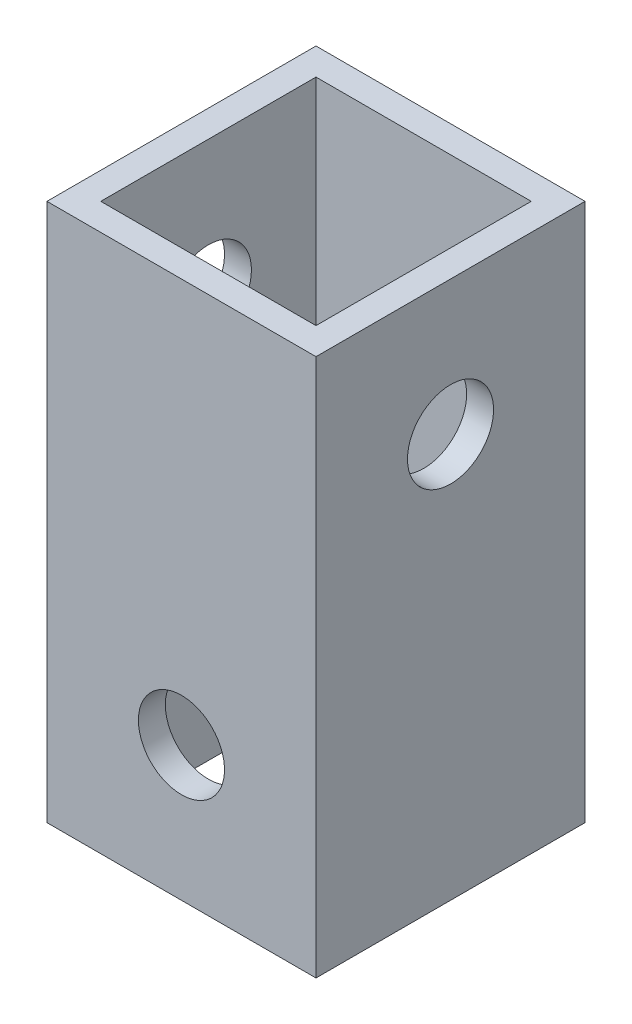
ISO-10303-21;
HEADER;
FILE_DESCRIPTION(('STEP AP214'),'2;1');
FILE_NAME('part.step','',(''),(''),'','','');
FILE_SCHEMA(('AUTOMOTIVE_DESIGN { 1 0 10303 214 1 1 1 1 }'));
ENDSEC;
DATA;
#1=APPLICATION_CONTEXT('core data for automotive mechanical design processes');
#2=APPLICATION_PROTOCOL_DEFINITION('international standard','automotive_design',2000,#1);
#3=PRODUCT_CONTEXT('',#1,'mechanical');
#4=PRODUCT('Part','Part','',(#3));
#5=PRODUCT_RELATED_PRODUCT_CATEGORY('part','',(#4));
#6=PRODUCT_DEFINITION_FORMATION('','',#4);
#7=PRODUCT_DEFINITION_CONTEXT('part definition',#1,'design');
#8=PRODUCT_DEFINITION('design','',#6,#7);
#9=PRODUCT_DEFINITION_SHAPE('','',#8);
#10=(LENGTH_UNIT() NAMED_UNIT(*) SI_UNIT(.MILLI.,.METRE.));
#11=(NAMED_UNIT(*) PLANE_ANGLE_UNIT() SI_UNIT($,.RADIAN.));
#12=(NAMED_UNIT(*) SI_UNIT($,.STERADIAN.) SOLID_ANGLE_UNIT());
#13=UNCERTAINTY_MEASURE_WITH_UNIT(LENGTH_MEASURE(1.E-05),#10,'distance_accuracy_value','');
#14=(GEOMETRIC_REPRESENTATION_CONTEXT(3) GLOBAL_UNCERTAINTY_ASSIGNED_CONTEXT((#13)) GLOBAL_UNIT_ASSIGNED_CONTEXT((#10,
#11,#12)) REPRESENTATION_CONTEXT('',''));
#15=CARTESIAN_POINT('',(0.,0.,0.));
#16=DIRECTION('',(0.,0.,1.));
#17=DIRECTION('',(1.,0.,0.));
#18=AXIS2_PLACEMENT_3D('',#15,#16,#17);
#19=CARTESIAN_POINT('',(0.,20.,0.));
#20=DIRECTION('',(0.,1.,0.));
#21=DIRECTION('',(0.,0.,1.));
#22=AXIS2_PLACEMENT_3D('',#19,#20,#21);
#23=PLANE('',#22);
#24=DIRECTION('',(0.,0.,-1.));
#25=VECTOR('',#24,1.);
#26=CARTESIAN_POINT('',(5.,20.,-5.));
#27=LINE('',#26,#25);
#28=CARTESIAN_POINT('',(5.,20.,5.));
#29=VERTEX_POINT('',#28);
#30=CARTESIAN_POINT('',(5.,20.,-5.));
#31=VERTEX_POINT('',#30);
#32=EDGE_CURVE('E146',#29,#31,#27,.T.);
#33=ORIENTED_EDGE('',*,*,#32,.T.);
#34=DIRECTION('',(-1.,0.,0.));
#35=VECTOR('',#34,1.);
#36=CARTESIAN_POINT('',(-5.,20.,-5.));
#37=LINE('',#36,#35);
#38=CARTESIAN_POINT('',(-5.,20.,-5.));
#39=VERTEX_POINT('',#38);
#40=EDGE_CURVE('E149',#31,#39,#37,.T.);
#41=ORIENTED_EDGE('',*,*,#40,.T.);
#42=DIRECTION('',(0.,0.,1.));
#43=VECTOR('',#42,1.);
#44=CARTESIAN_POINT('',(-5.,20.,-5.));
#45=LINE('',#44,#43);
#46=CARTESIAN_POINT('',(-5.,20.,5.));
#47=VERTEX_POINT('',#46);
#48=EDGE_CURVE('E152',#39,#47,#45,.T.);
#49=ORIENTED_EDGE('',*,*,#48,.T.);
#50=DIRECTION('',(1.,0.,0.));
#51=VECTOR('',#50,1.);
#52=CARTESIAN_POINT('',(-5.,20.,5.));
#53=LINE('',#52,#51);
#54=EDGE_CURVE('E154',#47,#29,#53,.T.);
#55=ORIENTED_EDGE('',*,*,#54,.T.);
#56=EDGE_LOOP('',(#33,#41,#49,#55));
#57=FACE_BOUND('',#56,.T.);
#58=DIRECTION('',(1.,0.,0.));
#59=VECTOR('',#58,1.);
#60=CARTESIAN_POINT('',(-4.,20.,4.));
#61=LINE('',#60,#59);
#62=CARTESIAN_POINT('',(-4.,20.,4.));
#63=VERTEX_POINT('',#62);
#64=CARTESIAN_POINT('',(4.,20.,4.));
#65=VERTEX_POINT('',#64);
#66=EDGE_CURVE('E116',#63,#65,#61,.T.);
#67=ORIENTED_EDGE('',*,*,#66,.F.);
#68=DIRECTION('',(0.,0.,1.));
#69=VECTOR('',#68,1.);
#70=CARTESIAN_POINT('',(-4.,20.,-4.));
#71=LINE('',#70,#69);
#72=CARTESIAN_POINT('',(-4.,20.,-4.));
#73=VERTEX_POINT('',#72);
#74=EDGE_CURVE('E108',#73,#63,#71,.T.);
#75=ORIENTED_EDGE('',*,*,#74,.F.);
#76=DIRECTION('',(-1.,0.,0.));
#77=VECTOR('',#76,1.);
#78=CARTESIAN_POINT('',(-4.,20.,-4.));
#79=LINE('',#78,#77);
#80=CARTESIAN_POINT('',(4.,20.,-4.));
#81=VERTEX_POINT('',#80);
#82=EDGE_CURVE('E130',#81,#73,#79,.T.);
#83=ORIENTED_EDGE('',*,*,#82,.F.);
#84=DIRECTION('',(0.,0.,-1.));
#85=VECTOR('',#84,1.);
#86=CARTESIAN_POINT('',(4.,20.,-4.));
#87=LINE('',#86,#85);
#88=EDGE_CURVE('E128',#65,#81,#87,.T.);
#89=ORIENTED_EDGE('',*,*,#88,.F.);
#90=EDGE_LOOP('',(#67,#75,#83,#89));
#91=FACE_BOUND('',#90,.T.);
#92=ADVANCED_FACE('F41',(#57,#91),#23,.T.);
#93=CARTESIAN_POINT('',(0.,0.,0.));
#94=DIRECTION('',(0.,1.,0.));
#95=DIRECTION('',(0.,0.,1.));
#96=AXIS2_PLACEMENT_3D('',#93,#94,#95);
#97=PLANE('',#96);
#98=DIRECTION('',(0.,0.,-1.));
#99=VECTOR('',#98,1.);
#100=CARTESIAN_POINT('',(5.,0.,-5.));
#101=LINE('',#100,#99);
#102=CARTESIAN_POINT('',(5.,0.,5.));
#103=VERTEX_POINT('',#102);
#104=CARTESIAN_POINT('',(5.,0.,-5.));
#105=VERTEX_POINT('',#104);
#106=EDGE_CURVE('E124',#103,#105,#101,.T.);
#107=ORIENTED_EDGE('',*,*,#106,.F.);
#108=DIRECTION('',(1.,0.,0.));
#109=VECTOR('',#108,1.);
#110=CARTESIAN_POINT('',(-5.,0.,5.));
#111=LINE('',#110,#109);
#112=CARTESIAN_POINT('',(-5.,0.,5.));
#113=VERTEX_POINT('',#112);
#114=EDGE_CURVE('E150',#113,#103,#111,.T.);
#115=ORIENTED_EDGE('',*,*,#114,.F.);
#116=DIRECTION('',(0.,0.,1.));
#117=VECTOR('',#116,1.);
#118=CARTESIAN_POINT('',(-5.,0.,-5.));
#119=LINE('',#118,#117);
#120=CARTESIAN_POINT('',(-5.,0.,-5.));
#121=VERTEX_POINT('',#120);
#122=EDGE_CURVE('E161',#121,#113,#119,.T.);
#123=ORIENTED_EDGE('',*,*,#122,.F.);
#124=DIRECTION('',(-1.,0.,0.));
#125=VECTOR('',#124,1.);
#126=CARTESIAN_POINT('',(-5.,0.,-5.));
#127=LINE('',#126,#125);
#128=EDGE_CURVE('E159',#105,#121,#127,.T.);
#129=ORIENTED_EDGE('',*,*,#128,.F.);
#130=EDGE_LOOP('',(#107,#115,#123,#129));
#131=FACE_BOUND('',#130,.T.);
#132=DIRECTION('',(0.,0.,1.));
#133=VECTOR('',#132,1.);
#134=CARTESIAN_POINT('',(-4.,0.,-4.));
#135=LINE('',#134,#133);
#136=CARTESIAN_POINT('',(-4.,0.,-4.));
#137=VERTEX_POINT('',#136);
#138=CARTESIAN_POINT('',(-4.,0.,4.));
#139=VERTEX_POINT('',#138);
#140=EDGE_CURVE('E66',#137,#139,#135,.T.);
#141=ORIENTED_EDGE('',*,*,#140,.T.);
#142=DIRECTION('',(1.,0.,0.));
#143=VECTOR('',#142,1.);
#144=CARTESIAN_POINT('',(-4.,0.,4.));
#145=LINE('',#144,#143);
#146=CARTESIAN_POINT('',(4.,0.,4.));
#147=VERTEX_POINT('',#146);
#148=EDGE_CURVE('E123',#139,#147,#145,.T.);
#149=ORIENTED_EDGE('',*,*,#148,.T.);
#150=DIRECTION('',(0.,0.,-1.));
#151=VECTOR('',#150,1.);
#152=CARTESIAN_POINT('',(4.,0.,-4.));
#153=LINE('',#152,#151);
#154=CARTESIAN_POINT('',(4.,0.,-4.));
#155=VERTEX_POINT('',#154);
#156=EDGE_CURVE('E138',#147,#155,#153,.T.);
#157=ORIENTED_EDGE('',*,*,#156,.T.);
#158=DIRECTION('',(-1.,0.,0.));
#159=VECTOR('',#158,1.);
#160=CARTESIAN_POINT('',(-4.,0.,-4.));
#161=LINE('',#160,#159);
#162=EDGE_CURVE('E117',#155,#137,#161,.T.);
#163=ORIENTED_EDGE('',*,*,#162,.T.);
#164=EDGE_LOOP('',(#141,#149,#157,#163));
#165=FACE_BOUND('',#164,.T.);
#166=ADVANCED_FACE('F210',(#131,#165),#97,.F.);
#167=CARTESIAN_POINT('',(5.,20.,-5.));
#168=DIRECTION('',(-1.,0.,0.));
#169=DIRECTION('',(0.,0.,1.));
#170=AXIS2_PLACEMENT_3D('',#167,#168,#169);
#171=PLANE('',#170);
#172=CARTESIAN_POINT('',(5.,15.,0.));
#173=DIRECTION('',(-1.,0.,0.));
#174=DIRECTION('',(0.,0.,1.));
#175=AXIS2_PLACEMENT_3D('',#172,#173,#174);
#176=CIRCLE('',#175,1.6);
#177=CARTESIAN_POINT('',(5.,15.,1.6));
#178=VERTEX_POINT('',#177);
#179=EDGE_CURVE('E179',#178,#178,#176,.T.);
#180=ORIENTED_EDGE('',*,*,#179,.T.);
#181=EDGE_LOOP('',(#180));
#182=FACE_BOUND('',#181,.T.);
#183=ORIENTED_EDGE('',*,*,#106,.T.);
#184=DIRECTION('',(0.,-1.,0.));
#185=VECTOR('',#184,1.);
#186=CARTESIAN_POINT('',(5.,20.,-5.));
#187=LINE('',#186,#185);
#188=EDGE_CURVE('E11',#31,#105,#187,.T.);
#189=ORIENTED_EDGE('',*,*,#188,.F.);
#190=ORIENTED_EDGE('',*,*,#32,.F.);
#191=DIRECTION('',(0.,-1.,0.));
#192=VECTOR('',#191,1.);
#193=CARTESIAN_POINT('',(5.,20.,5.));
#194=LINE('',#193,#192);
#195=EDGE_CURVE('E156',#29,#103,#194,.T.);
#196=ORIENTED_EDGE('',*,*,#195,.T.);
#197=EDGE_LOOP('',(#183,#189,#190,#196));
#198=FACE_BOUND('',#197,.T.);
#199=ADVANCED_FACE('F43',(#182,#198),#171,.F.);
#200=CARTESIAN_POINT('',(-5.,20.,-5.));
#201=DIRECTION('',(0.,0.,1.));
#202=DIRECTION('',(1.,0.,0.));
#203=AXIS2_PLACEMENT_3D('',#200,#201,#202);
#204=PLANE('',#203);
#205=CARTESIAN_POINT('',(0.,5.,-5.));
#206=DIRECTION('',(0.,0.,-1.));
#207=DIRECTION('',(-1.,0.,0.));
#208=AXIS2_PLACEMENT_3D('',#205,#206,#207);
#209=CIRCLE('',#208,1.6);
#210=CARTESIAN_POINT('',(-1.6,5.,-5.));
#211=VERTEX_POINT('',#210);
#212=EDGE_CURVE('E173',#211,#211,#209,.T.);
#213=ORIENTED_EDGE('',*,*,#212,.F.);
#214=EDGE_LOOP('',(#213));
#215=FACE_BOUND('',#214,.T.);
#216=ORIENTED_EDGE('',*,*,#128,.T.);
#217=DIRECTION('',(0.,-1.,0.));
#218=VECTOR('',#217,1.);
#219=CARTESIAN_POINT('',(-5.,20.,-5.));
#220=LINE('',#219,#218);
#221=EDGE_CURVE('E50',#39,#121,#220,.T.);
#222=ORIENTED_EDGE('',*,*,#221,.F.);
#223=ORIENTED_EDGE('',*,*,#40,.F.);
#224=ORIENTED_EDGE('',*,*,#188,.T.);
#225=EDGE_LOOP('',(#216,#222,#223,#224));
#226=FACE_BOUND('',#225,.T.);
#227=ADVANCED_FACE('F225',(#215,#226),#204,.F.);
#228=CARTESIAN_POINT('',(-5.,20.,-5.));
#229=DIRECTION('',(1.,0.,0.));
#230=DIRECTION('',(0.,0.,-1.));
#231=AXIS2_PLACEMENT_3D('',#228,#229,#230);
#232=PLANE('',#231);
#233=CARTESIAN_POINT('',(-5.,15.,0.));
#234=DIRECTION('',(-1.,0.,0.));
#235=DIRECTION('',(0.,0.,1.));
#236=AXIS2_PLACEMENT_3D('',#233,#234,#235);
#237=CIRCLE('',#236,1.6);
#238=CARTESIAN_POINT('',(-5.,15.,1.6));
#239=VERTEX_POINT('',#238);
#240=EDGE_CURVE('E268',#239,#239,#237,.T.);
#241=ORIENTED_EDGE('',*,*,#240,.F.);
#242=EDGE_LOOP('',(#241));
#243=FACE_BOUND('',#242,.T.);
#244=ORIENTED_EDGE('',*,*,#122,.T.);
#245=DIRECTION('',(0.,-1.,0.));
#246=VECTOR('',#245,1.);
#247=CARTESIAN_POINT('',(-5.,20.,5.));
#248=LINE('',#247,#246);
#249=EDGE_CURVE('E166',#47,#113,#248,.T.);
#250=ORIENTED_EDGE('',*,*,#249,.F.);
#251=ORIENTED_EDGE('',*,*,#48,.F.);
#252=ORIENTED_EDGE('',*,*,#221,.T.);
#253=EDGE_LOOP('',(#244,#250,#251,#252));
#254=FACE_BOUND('',#253,.T.);
#255=ADVANCED_FACE('F223',(#243,#254),#232,.F.);
#256=CARTESIAN_POINT('',(-5.,20.,5.));
#257=DIRECTION('',(0.,0.,-1.));
#258=DIRECTION('',(-1.,0.,0.));
#259=AXIS2_PLACEMENT_3D('',#256,#257,#258);
#260=PLANE('',#259);
#261=CARTESIAN_POINT('',(0.,5.,5.));
#262=DIRECTION('',(0.,0.,-1.));
#263=DIRECTION('',(-1.,0.,0.));
#264=AXIS2_PLACEMENT_3D('',#261,#262,#263);
#265=CIRCLE('',#264,1.6);
#266=CARTESIAN_POINT('',(-1.6,5.,5.));
#267=VERTEX_POINT('',#266);
#268=EDGE_CURVE('E136',#267,#267,#265,.T.);
#269=ORIENTED_EDGE('',*,*,#268,.T.);
#270=EDGE_LOOP('',(#269));
#271=FACE_BOUND('',#270,.T.);
#272=ORIENTED_EDGE('',*,*,#114,.T.);
#273=ORIENTED_EDGE('',*,*,#195,.F.);
#274=ORIENTED_EDGE('',*,*,#54,.F.);
#275=ORIENTED_EDGE('',*,*,#249,.T.);
#276=EDGE_LOOP('',(#272,#273,#274,#275));
#277=FACE_BOUND('',#276,.T.);
#278=ADVANCED_FACE('F190',(#271,#277),#260,.F.);
#279=CARTESIAN_POINT('',(-4.,20.,-4.));
#280=DIRECTION('',(1.,0.,0.));
#281=DIRECTION('',(0.,0.,-1.));
#282=AXIS2_PLACEMENT_3D('',#279,#280,#281);
#283=PLANE('',#282);
#284=CARTESIAN_POINT('',(-4.,15.,0.));
#285=DIRECTION('',(1.,0.,0.));
#286=DIRECTION('',(0.,0.,-1.));
#287=AXIS2_PLACEMENT_3D('',#284,#285,#286);
#288=CIRCLE('',#287,1.6);
#289=CARTESIAN_POINT('',(-4.,15.,-1.6));
#290=VERTEX_POINT('',#289);
#291=EDGE_CURVE('E184',#290,#290,#288,.T.);
#292=ORIENTED_EDGE('',*,*,#291,.F.);
#293=EDGE_LOOP('',(#292));
#294=FACE_BOUND('',#293,.T.);
#295=ORIENTED_EDGE('',*,*,#140,.F.);
#296=DIRECTION('',(0.,-1.,0.));
#297=VECTOR('',#296,1.);
#298=CARTESIAN_POINT('',(-4.,20.,-4.));
#299=LINE('',#298,#297);
#300=EDGE_CURVE('E112',#73,#137,#299,.T.);
#301=ORIENTED_EDGE('',*,*,#300,.F.);
#302=ORIENTED_EDGE('',*,*,#74,.T.);
#303=DIRECTION('',(0.,-1.,0.));
#304=VECTOR('',#303,1.);
#305=CARTESIAN_POINT('',(-4.,20.,4.));
#306=LINE('',#305,#304);
#307=EDGE_CURVE('E111',#63,#139,#306,.T.);
#308=ORIENTED_EDGE('',*,*,#307,.T.);
#309=EDGE_LOOP('',(#295,#301,#302,#308));
#310=FACE_BOUND('',#309,.T.);
#311=ADVANCED_FACE('F110',(#294,#310),#283,.T.);
#312=CARTESIAN_POINT('',(-4.,20.,4.));
#313=DIRECTION('',(0.,0.,-1.));
#314=DIRECTION('',(-1.,0.,0.));
#315=AXIS2_PLACEMENT_3D('',#312,#313,#314);
#316=PLANE('',#315);
#317=CARTESIAN_POINT('',(0.,5.,4.));
#318=DIRECTION('',(0.,0.,-1.));
#319=DIRECTION('',(-1.,0.,0.));
#320=AXIS2_PLACEMENT_3D('',#317,#318,#319);
#321=CIRCLE('',#320,1.6);
#322=CARTESIAN_POINT('',(-1.6,5.,4.));
#323=VERTEX_POINT('',#322);
#324=EDGE_CURVE('E172',#323,#323,#321,.T.);
#325=ORIENTED_EDGE('',*,*,#324,.F.);
#326=EDGE_LOOP('',(#325));
#327=FACE_BOUND('',#326,.T.);
#328=ORIENTED_EDGE('',*,*,#148,.F.);
#329=ORIENTED_EDGE('',*,*,#307,.F.);
#330=ORIENTED_EDGE('',*,*,#66,.T.);
#331=DIRECTION('',(0.,-1.,0.));
#332=VECTOR('',#331,1.);
#333=CARTESIAN_POINT('',(4.,20.,4.));
#334=LINE('',#333,#332);
#335=EDGE_CURVE('E125',#65,#147,#334,.T.);
#336=ORIENTED_EDGE('',*,*,#335,.T.);
#337=EDGE_LOOP('',(#328,#329,#330,#336));
#338=FACE_BOUND('',#337,.T.);
#339=ADVANCED_FACE('F120',(#327,#338),#316,.T.);
#340=CARTESIAN_POINT('',(4.,20.,-4.));
#341=DIRECTION('',(-1.,0.,0.));
#342=DIRECTION('',(0.,0.,1.));
#343=AXIS2_PLACEMENT_3D('',#340,#341,#342);
#344=PLANE('',#343);
#345=CARTESIAN_POINT('',(4.,15.,0.));
#346=DIRECTION('',(-1.,0.,0.));
#347=DIRECTION('',(0.,0.,1.));
#348=AXIS2_PLACEMENT_3D('',#345,#346,#347);
#349=CIRCLE('',#348,1.6);
#350=CARTESIAN_POINT('',(4.,15.,1.6));
#351=VERTEX_POINT('',#350);
#352=EDGE_CURVE('E45',#351,#351,#349,.T.);
#353=ORIENTED_EDGE('',*,*,#352,.F.);
#354=EDGE_LOOP('',(#353));
#355=FACE_BOUND('',#354,.T.);
#356=ORIENTED_EDGE('',*,*,#156,.F.);
#357=ORIENTED_EDGE('',*,*,#335,.F.);
#358=ORIENTED_EDGE('',*,*,#88,.T.);
#359=DIRECTION('',(0.,-1.,0.));
#360=VECTOR('',#359,1.);
#361=CARTESIAN_POINT('',(4.,20.,-4.));
#362=LINE('',#361,#360);
#363=EDGE_CURVE('E58',#81,#155,#362,.T.);
#364=ORIENTED_EDGE('',*,*,#363,.T.);
#365=EDGE_LOOP('',(#356,#357,#358,#364));
#366=FACE_BOUND('',#365,.T.);
#367=ADVANCED_FACE('F248',(#355,#366),#344,.T.);
#368=CARTESIAN_POINT('',(-4.,20.,-4.));
#369=DIRECTION('',(0.,0.,1.));
#370=DIRECTION('',(1.,0.,0.));
#371=AXIS2_PLACEMENT_3D('',#368,#369,#370);
#372=PLANE('',#371);
#373=CARTESIAN_POINT('',(0.,5.,-4.));
#374=DIRECTION('',(0.,0.,1.));
#375=DIRECTION('',(1.,0.,0.));
#376=AXIS2_PLACEMENT_3D('',#373,#374,#375);
#377=CIRCLE('',#376,1.6);
#378=CARTESIAN_POINT('',(1.6,5.,-4.));
#379=VERTEX_POINT('',#378);
#380=EDGE_CURVE('E170',#379,#379,#377,.T.);
#381=ORIENTED_EDGE('',*,*,#380,.F.);
#382=EDGE_LOOP('',(#381));
#383=FACE_BOUND('',#382,.T.);
#384=ORIENTED_EDGE('',*,*,#162,.F.);
#385=ORIENTED_EDGE('',*,*,#363,.F.);
#386=ORIENTED_EDGE('',*,*,#82,.T.);
#387=ORIENTED_EDGE('',*,*,#300,.T.);
#388=EDGE_LOOP('',(#384,#385,#386,#387));
#389=FACE_BOUND('',#388,.T.);
#390=ADVANCED_FACE('F207',(#383,#389),#372,.T.);
#391=CARTESIAN_POINT('',(0.,5.,15.));
#392=DIRECTION('',(0.,0.,-1.));
#393=DIRECTION('',(-1.,0.,0.));
#394=AXIS2_PLACEMENT_3D('',#391,#392,#393);
#395=CYLINDRICAL_SURFACE('',#394,1.6);
#396=ORIENTED_EDGE('',*,*,#380,.T.);
#397=EDGE_LOOP('',(#396));
#398=FACE_BOUND('',#397,.T.);
#399=ORIENTED_EDGE('',*,*,#212,.T.);
#400=EDGE_LOOP('',(#399));
#401=FACE_BOUND('',#400,.T.);
#402=ADVANCED_FACE('F196',(#398,#401),#395,.F.);
#403=ORIENTED_EDGE('',*,*,#324,.T.);
#404=EDGE_LOOP('',(#403));
#405=FACE_BOUND('',#404,.T.);
#406=ORIENTED_EDGE('',*,*,#268,.F.);
#407=EDGE_LOOP('',(#406));
#408=FACE_BOUND('',#407,.T.);
#409=ADVANCED_FACE('F193',(#405,#408),#395,.F.);
#410=CARTESIAN_POINT('',(15.,15.,0.));
#411=DIRECTION('',(-1.,0.,0.));
#412=DIRECTION('',(0.,0.,1.));
#413=AXIS2_PLACEMENT_3D('',#410,#411,#412);
#414=CYLINDRICAL_SURFACE('',#413,1.6);
#415=ORIENTED_EDGE('',*,*,#352,.T.);
#416=EDGE_LOOP('',(#415));
#417=FACE_BOUND('',#416,.T.);
#418=ORIENTED_EDGE('',*,*,#179,.F.);
#419=EDGE_LOOP('',(#418));
#420=FACE_BOUND('',#419,.T.);
#421=ADVANCED_FACE('F195',(#417,#420),#414,.F.);
#422=ORIENTED_EDGE('',*,*,#291,.T.);
#423=EDGE_LOOP('',(#422));
#424=FACE_BOUND('',#423,.T.);
#425=ORIENTED_EDGE('',*,*,#240,.T.);
#426=EDGE_LOOP('',(#425));
#427=FACE_BOUND('',#426,.T.);
#428=ADVANCED_FACE('F204',(#424,#427),#414,.F.);
#429=CLOSED_SHELL('',(#92,#166,#199,#227,#255,#278,#311,#339,#367,#390,#402,#409,#421,#428));
#430=MANIFOLD_SOLID_BREP('B2',#429);
#431=ADVANCED_BREP_SHAPE_REPRESENTATION('',(#18,#430),#14);
#432=SHAPE_DEFINITION_REPRESENTATION(#9,#431);
ENDSEC;
END-ISO-10303-21;
